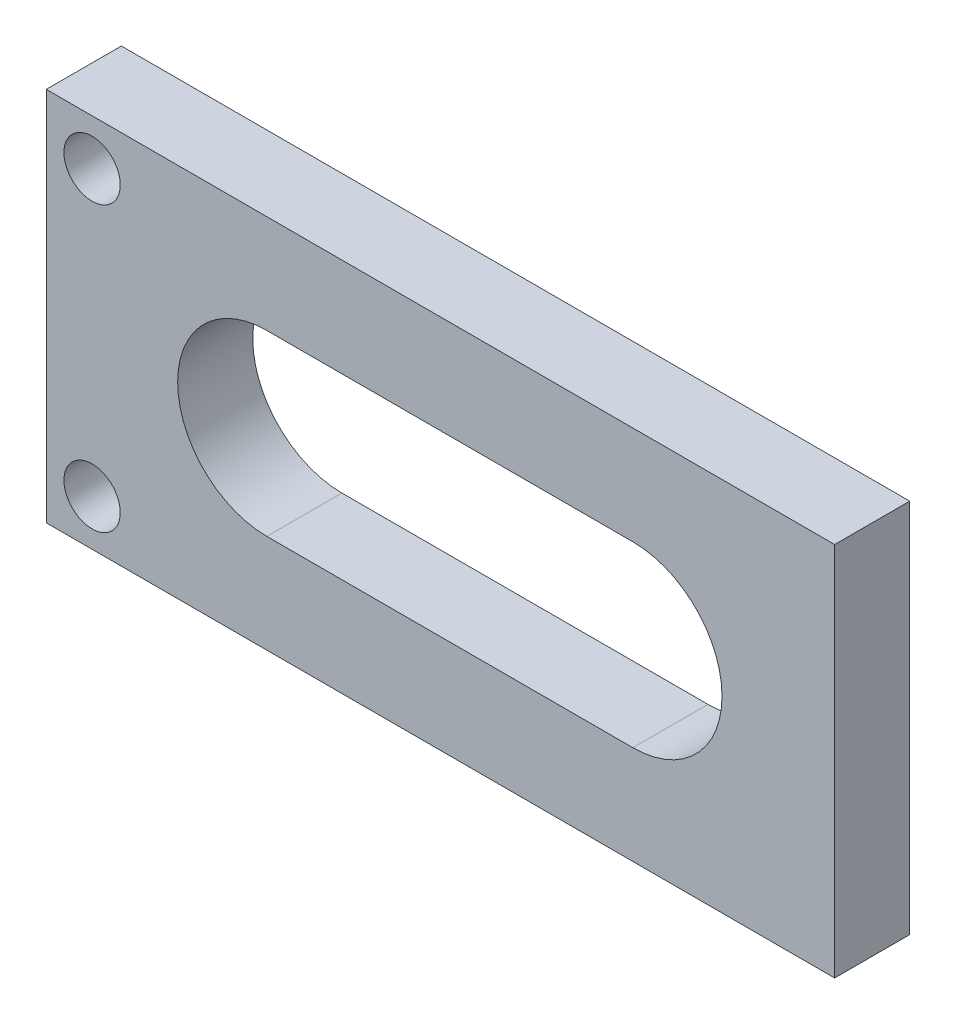
ISO-10303-21;
HEADER;
FILE_DESCRIPTION(('STEP AP214'),'2;1');
FILE_NAME('part.step','',(''),(''),'','','');
FILE_SCHEMA(('AUTOMOTIVE_DESIGN { 1 0 10303 214 1 1 1 1 }'));
ENDSEC;
DATA;
#1=APPLICATION_CONTEXT('core data for automotive mechanical design processes');
#2=APPLICATION_PROTOCOL_DEFINITION('international standard','automotive_design',2000,#1);
#3=PRODUCT_CONTEXT('',#1,'mechanical');
#4=PRODUCT('Part','Part','',(#3));
#5=PRODUCT_RELATED_PRODUCT_CATEGORY('part','',(#4));
#6=PRODUCT_DEFINITION_FORMATION('','',#4);
#7=PRODUCT_DEFINITION_CONTEXT('part definition',#1,'design');
#8=PRODUCT_DEFINITION('design','',#6,#7);
#9=PRODUCT_DEFINITION_SHAPE('','',#8);
#10=(LENGTH_UNIT() NAMED_UNIT(*) SI_UNIT(.MILLI.,.METRE.));
#11=(NAMED_UNIT(*) PLANE_ANGLE_UNIT() SI_UNIT($,.RADIAN.));
#12=(NAMED_UNIT(*) SI_UNIT($,.STERADIAN.) SOLID_ANGLE_UNIT());
#13=UNCERTAINTY_MEASURE_WITH_UNIT(LENGTH_MEASURE(1.E-05),#10,'distance_accuracy_value','');
#14=(GEOMETRIC_REPRESENTATION_CONTEXT(3) GLOBAL_UNCERTAINTY_ASSIGNED_CONTEXT((#13)) GLOBAL_UNIT_ASSIGNED_CONTEXT((#10,
#11,#12)) REPRESENTATION_CONTEXT('',''));
#15=CARTESIAN_POINT('',(0.,0.,0.));
#16=DIRECTION('',(0.,0.,1.));
#17=DIRECTION('',(1.,0.,0.));
#18=AXIS2_PLACEMENT_3D('',#15,#16,#17);
#19=CARTESIAN_POINT('',(0.,0.,4.));
#20=DIRECTION('',(0.,0.,1.));
#21=DIRECTION('',(1.,0.,0.));
#22=AXIS2_PLACEMENT_3D('',#19,#20,#21);
#23=PLANE('',#22);
#24=CARTESIAN_POINT('',(-18.5593059383903,-7.55930593839025,4.));
#25=DIRECTION('',(0.,0.,1.));
#26=DIRECTION('',(1.,0.,0.));
#27=AXIS2_PLACEMENT_3D('',#24,#25,#26);
#28=CIRCLE('',#27,1.5);
#29=CARTESIAN_POINT('',(-17.0593059383902,-7.55930593839025,4.));
#30=VERTEX_POINT('',#29);
#31=EDGE_CURVE('E135',#30,#30,#28,.T.);
#32=ORIENTED_EDGE('',*,*,#31,.F.);
#33=EDGE_LOOP('',(#32));
#34=FACE_BOUND('',#33,.T.);
#35=DIRECTION('',(0.,1.,0.));
#36=VECTOR('',#35,1.);
#37=CARTESIAN_POINT('',(21.,9.99999999999999,4.));
#38=LINE('',#37,#36);
#39=CARTESIAN_POINT('',(21.,-10.,4.));
#40=VERTEX_POINT('',#39);
#41=CARTESIAN_POINT('',(21.,9.99999999999999,4.));
#42=VERTEX_POINT('',#41);
#43=EDGE_CURVE('E145',#40,#42,#38,.T.);
#44=ORIENTED_EDGE('',*,*,#43,.T.);
#45=DIRECTION('',(-1.,0.,0.));
#46=VECTOR('',#45,1.);
#47=CARTESIAN_POINT('',(-21.,9.99999999999999,4.));
#48=LINE('',#47,#46);
#49=CARTESIAN_POINT('',(-21.,9.99999999999999,4.));
#50=VERTEX_POINT('',#49);
#51=EDGE_CURVE('E148',#42,#50,#48,.T.);
#52=ORIENTED_EDGE('',*,*,#51,.T.);
#53=DIRECTION('',(0.,-1.,0.));
#54=VECTOR('',#53,1.);
#55=CARTESIAN_POINT('',(-21.,9.99999999999999,4.));
#56=LINE('',#55,#54);
#57=CARTESIAN_POINT('',(-21.,-10.,4.));
#58=VERTEX_POINT('',#57);
#59=EDGE_CURVE('E151',#50,#58,#56,.T.);
#60=ORIENTED_EDGE('',*,*,#59,.T.);
#61=DIRECTION('',(1.,0.,0.));
#62=VECTOR('',#61,1.);
#63=CARTESIAN_POINT('',(-21.,-10.,4.));
#64=LINE('',#63,#62);
#65=EDGE_CURVE('E153',#58,#40,#64,.T.);
#66=ORIENTED_EDGE('',*,*,#65,.T.);
#67=EDGE_LOOP('',(#44,#52,#60,#66));
#68=FACE_BOUND('',#67,.T.);
#69=DIRECTION('',(1.,0.,0.));
#70=VECTOR('',#69,1.);
#71=CARTESIAN_POINT('',(-9.25000000000001,-4.75,4.));
#72=LINE('',#71,#70);
#73=CARTESIAN_POINT('',(-9.25000000000001,-4.75,4.));
#74=VERTEX_POINT('',#73);
#75=CARTESIAN_POINT('',(10.25,-4.75,4.));
#76=VERTEX_POINT('',#75);
#77=EDGE_CURVE('E114',#74,#76,#72,.T.);
#78=ORIENTED_EDGE('',*,*,#77,.F.);
#79=CARTESIAN_POINT('',(-9.25000000000001,0.,4.));
#80=DIRECTION('',(0.,0.,1.));
#81=DIRECTION('',(1.,0.,0.));
#82=AXIS2_PLACEMENT_3D('',#79,#80,#81);
#83=CIRCLE('',#82,4.75);
#84=CARTESIAN_POINT('',(-9.25000000000001,4.75,4.));
#85=VERTEX_POINT('',#84);
#86=EDGE_CURVE('E106',#85,#74,#83,.T.);
#87=ORIENTED_EDGE('',*,*,#86,.F.);
#88=DIRECTION('',(-1.,0.,0.));
#89=VECTOR('',#88,1.);
#90=CARTESIAN_POINT('',(-9.25000000000001,4.75,4.));
#91=LINE('',#90,#89);
#92=CARTESIAN_POINT('',(10.25,4.75,4.));
#93=VERTEX_POINT('',#92);
#94=EDGE_CURVE('E129',#93,#85,#91,.T.);
#95=ORIENTED_EDGE('',*,*,#94,.F.);
#96=CARTESIAN_POINT('',(10.25,0.,4.));
#97=DIRECTION('',(0.,0.,1.));
#98=DIRECTION('',(1.,0.,0.));
#99=AXIS2_PLACEMENT_3D('',#96,#97,#98);
#100=CIRCLE('',#99,4.75);
#101=EDGE_CURVE('E127',#76,#93,#100,.T.);
#102=ORIENTED_EDGE('',*,*,#101,.F.);
#103=EDGE_LOOP('',(#78,#87,#95,#102));
#104=FACE_BOUND('',#103,.T.);
#105=CARTESIAN_POINT('',(-18.5593059383903,7.55930593839025,4.));
#106=DIRECTION('',(0.,0.,1.));
#107=DIRECTION('',(-1.,0.,0.));
#108=AXIS2_PLACEMENT_3D('',#105,#106,#107);
#109=CIRCLE('',#108,1.5);
#110=CARTESIAN_POINT('',(-20.0593059383903,7.55930593839025,4.));
#111=VERTEX_POINT('',#110);
#112=EDGE_CURVE('E235',#111,#111,#109,.T.);
#113=ORIENTED_EDGE('',*,*,#112,.F.);
#114=EDGE_LOOP('',(#113));
#115=FACE_BOUND('',#114,.T.);
#116=ADVANCED_FACE('F41',(#34,#68,#104,#115),#23,.T.);
#117=CARTESIAN_POINT('',(0.,0.,0.));
#118=DIRECTION('',(0.,0.,1.));
#119=DIRECTION('',(1.,0.,0.));
#120=AXIS2_PLACEMENT_3D('',#117,#118,#119);
#121=PLANE('',#120);
#122=DIRECTION('',(0.,1.,0.));
#123=VECTOR('',#122,1.);
#124=CARTESIAN_POINT('',(21.,9.99999999999999,0.));
#125=LINE('',#124,#123);
#126=CARTESIAN_POINT('',(21.,-10.,0.));
#127=VERTEX_POINT('',#126);
#128=CARTESIAN_POINT('',(21.,9.99999999999999,0.));
#129=VERTEX_POINT('',#128);
#130=EDGE_CURVE('E122',#127,#129,#125,.T.);
#131=ORIENTED_EDGE('',*,*,#130,.F.);
#132=DIRECTION('',(1.,0.,0.));
#133=VECTOR('',#132,1.);
#134=CARTESIAN_POINT('',(-21.,-10.,0.));
#135=LINE('',#134,#133);
#136=CARTESIAN_POINT('',(-21.,-10.,0.));
#137=VERTEX_POINT('',#136);
#138=EDGE_CURVE('E149',#137,#127,#135,.T.);
#139=ORIENTED_EDGE('',*,*,#138,.F.);
#140=DIRECTION('',(0.,-1.,0.));
#141=VECTOR('',#140,1.);
#142=CARTESIAN_POINT('',(-21.,9.99999999999999,0.));
#143=LINE('',#142,#141);
#144=CARTESIAN_POINT('',(-21.,9.99999999999999,0.));
#145=VERTEX_POINT('',#144);
#146=EDGE_CURVE('E160',#145,#137,#143,.T.);
#147=ORIENTED_EDGE('',*,*,#146,.F.);
#148=DIRECTION('',(-1.,0.,0.));
#149=VECTOR('',#148,1.);
#150=CARTESIAN_POINT('',(-21.,9.99999999999999,0.));
#151=LINE('',#150,#149);
#152=EDGE_CURVE('E158',#129,#145,#151,.T.);
#153=ORIENTED_EDGE('',*,*,#152,.F.);
#154=EDGE_LOOP('',(#131,#139,#147,#153));
#155=FACE_BOUND('',#154,.T.);
#156=CARTESIAN_POINT('',(-9.25000000000001,0.,0.));
#157=DIRECTION('',(0.,0.,1.));
#158=DIRECTION('',(1.,0.,0.));
#159=AXIS2_PLACEMENT_3D('',#156,#157,#158);
#160=CIRCLE('',#159,4.75);
#161=CARTESIAN_POINT('',(-9.25000000000001,4.75,0.));
#162=VERTEX_POINT('',#161);
#163=CARTESIAN_POINT('',(-9.25000000000001,-4.75,0.));
#164=VERTEX_POINT('',#163);
#165=EDGE_CURVE('E64',#162,#164,#160,.T.);
#166=ORIENTED_EDGE('',*,*,#165,.T.);
#167=DIRECTION('',(1.,0.,0.));
#168=VECTOR('',#167,1.);
#169=CARTESIAN_POINT('',(-9.25000000000001,-4.75,0.));
#170=LINE('',#169,#168);
#171=CARTESIAN_POINT('',(10.25,-4.75,0.));
#172=VERTEX_POINT('',#171);
#173=EDGE_CURVE('E121',#164,#172,#170,.T.);
#174=ORIENTED_EDGE('',*,*,#173,.T.);
#175=CARTESIAN_POINT('',(10.25,0.,0.));
#176=DIRECTION('',(0.,0.,1.));
#177=DIRECTION('',(1.,0.,0.));
#178=AXIS2_PLACEMENT_3D('',#175,#176,#177);
#179=CIRCLE('',#178,4.75);
#180=CARTESIAN_POINT('',(10.25,4.75,0.));
#181=VERTEX_POINT('',#180);
#182=EDGE_CURVE('E137',#172,#181,#179,.T.);
#183=ORIENTED_EDGE('',*,*,#182,.T.);
#184=DIRECTION('',(-1.,0.,0.));
#185=VECTOR('',#184,1.);
#186=CARTESIAN_POINT('',(-9.25000000000001,4.75,0.));
#187=LINE('',#186,#185);
#188=EDGE_CURVE('E115',#181,#162,#187,.T.);
#189=ORIENTED_EDGE('',*,*,#188,.T.);
#190=EDGE_LOOP('',(#166,#174,#183,#189));
#191=FACE_BOUND('',#190,.T.);
#192=CARTESIAN_POINT('',(-18.5593059383903,-7.55930593839025,0.));
#193=DIRECTION('',(0.,0.,1.));
#194=DIRECTION('',(1.,0.,0.));
#195=AXIS2_PLACEMENT_3D('',#192,#193,#194);
#196=CIRCLE('',#195,1.5);
#197=CARTESIAN_POINT('',(-17.0593059383902,-7.55930593839025,0.));
#198=VERTEX_POINT('',#197);
#199=EDGE_CURVE('E241',#198,#198,#196,.T.);
#200=ORIENTED_EDGE('',*,*,#199,.T.);
#201=EDGE_LOOP('',(#200));
#202=FACE_BOUND('',#201,.T.);
#203=CARTESIAN_POINT('',(-18.5593059383903,7.55930593839025,0.));
#204=DIRECTION('',(0.,0.,1.));
#205=DIRECTION('',(-1.,0.,0.));
#206=AXIS2_PLACEMENT_3D('',#203,#204,#205);
#207=CIRCLE('',#206,1.5);
#208=CARTESIAN_POINT('',(-20.0593059383903,7.55930593839025,0.));
#209=VERTEX_POINT('',#208);
#210=EDGE_CURVE('E238',#209,#209,#207,.T.);
#211=ORIENTED_EDGE('',*,*,#210,.T.);
#212=EDGE_LOOP('',(#211));
#213=FACE_BOUND('',#212,.T.);
#214=ADVANCED_FACE('F178',(#155,#191,#202,#213),#121,.F.);
#215=CARTESIAN_POINT('',(21.,9.99999999999999,4.));
#216=DIRECTION('',(-1.,0.,0.));
#217=DIRECTION('',(0.,0.,1.));
#218=AXIS2_PLACEMENT_3D('',#215,#216,#217);
#219=PLANE('',#218);
#220=ORIENTED_EDGE('',*,*,#130,.T.);
#221=DIRECTION('',(0.,0.,-1.));
#222=VECTOR('',#221,1.);
#223=CARTESIAN_POINT('',(21.,9.99999999999999,4.));
#224=LINE('',#223,#222);
#225=EDGE_CURVE('E11',#42,#129,#224,.T.);
#226=ORIENTED_EDGE('',*,*,#225,.F.);
#227=ORIENTED_EDGE('',*,*,#43,.F.);
#228=DIRECTION('',(0.,0.,-1.));
#229=VECTOR('',#228,1.);
#230=CARTESIAN_POINT('',(21.,-10.,4.));
#231=LINE('',#230,#229);
#232=EDGE_CURVE('E155',#40,#127,#231,.T.);
#233=ORIENTED_EDGE('',*,*,#232,.T.);
#234=EDGE_LOOP('',(#220,#226,#227,#233));
#235=FACE_BOUND('',#234,.T.);
#236=ADVANCED_FACE('F43',(#235),#219,.F.);
#237=CARTESIAN_POINT('',(-21.,9.99999999999999,4.));
#238=DIRECTION('',(0.,-1.,0.));
#239=DIRECTION('',(0.,0.,-1.));
#240=AXIS2_PLACEMENT_3D('',#237,#238,#239);
#241=PLANE('',#240);
#242=ORIENTED_EDGE('',*,*,#152,.T.);
#243=DIRECTION('',(0.,0.,-1.));
#244=VECTOR('',#243,1.);
#245=CARTESIAN_POINT('',(-21.,9.99999999999999,4.));
#246=LINE('',#245,#244);
#247=EDGE_CURVE('E49',#50,#145,#246,.T.);
#248=ORIENTED_EDGE('',*,*,#247,.F.);
#249=ORIENTED_EDGE('',*,*,#51,.F.);
#250=ORIENTED_EDGE('',*,*,#225,.T.);
#251=EDGE_LOOP('',(#242,#248,#249,#250));
#252=FACE_BOUND('',#251,.T.);
#253=ADVANCED_FACE('F188',(#252),#241,.F.);
#254=CARTESIAN_POINT('',(-21.,9.99999999999999,4.));
#255=DIRECTION('',(1.,0.,0.));
#256=DIRECTION('',(0.,1.,0.));
#257=AXIS2_PLACEMENT_3D('',#254,#255,#256);
#258=PLANE('',#257);
#259=ORIENTED_EDGE('',*,*,#146,.T.);
#260=DIRECTION('',(0.,0.,-1.));
#261=VECTOR('',#260,1.);
#262=CARTESIAN_POINT('',(-21.,-10.,4.));
#263=LINE('',#262,#261);
#264=EDGE_CURVE('E165',#58,#137,#263,.T.);
#265=ORIENTED_EDGE('',*,*,#264,.F.);
#266=ORIENTED_EDGE('',*,*,#59,.F.);
#267=ORIENTED_EDGE('',*,*,#247,.T.);
#268=EDGE_LOOP('',(#259,#265,#266,#267));
#269=FACE_BOUND('',#268,.T.);
#270=ADVANCED_FACE('F172',(#269),#258,.F.);
#271=CARTESIAN_POINT('',(-21.,-10.,4.));
#272=DIRECTION('',(0.,1.,0.));
#273=DIRECTION('',(0.,0.,1.));
#274=AXIS2_PLACEMENT_3D('',#271,#272,#273);
#275=PLANE('',#274);
#276=ORIENTED_EDGE('',*,*,#138,.T.);
#277=ORIENTED_EDGE('',*,*,#232,.F.);
#278=ORIENTED_EDGE('',*,*,#65,.F.);
#279=ORIENTED_EDGE('',*,*,#264,.T.);
#280=EDGE_LOOP('',(#276,#277,#278,#279));
#281=FACE_BOUND('',#280,.T.);
#282=ADVANCED_FACE('F182',(#281),#275,.F.);
#283=CARTESIAN_POINT('',(-9.25000000000001,0.,4.));
#284=DIRECTION('',(0.,0.,-1.));
#285=DIRECTION('',(-1.,0.,0.));
#286=AXIS2_PLACEMENT_3D('',#283,#284,#285);
#287=CYLINDRICAL_SURFACE('',#286,4.75);
#288=ORIENTED_EDGE('',*,*,#165,.F.);
#289=DIRECTION('',(0.,0.,-1.));
#290=VECTOR('',#289,1.);
#291=CARTESIAN_POINT('',(-9.25000000000001,4.75,4.));
#292=LINE('',#291,#290);
#293=EDGE_CURVE('E110',#85,#162,#292,.T.);
#294=ORIENTED_EDGE('',*,*,#293,.F.);
#295=ORIENTED_EDGE('',*,*,#86,.T.);
#296=DIRECTION('',(0.,0.,-1.));
#297=VECTOR('',#296,1.);
#298=CARTESIAN_POINT('',(-9.25000000000001,-4.75,4.));
#299=LINE('',#298,#297);
#300=EDGE_CURVE('E109',#74,#164,#299,.T.);
#301=ORIENTED_EDGE('',*,*,#300,.T.);
#302=EDGE_LOOP('',(#288,#294,#295,#301));
#303=FACE_BOUND('',#302,.T.);
#304=ADVANCED_FACE('F108',(#303),#287,.F.);
#305=CARTESIAN_POINT('',(-9.25000000000001,-4.75,4.));
#306=DIRECTION('',(0.,1.,0.));
#307=DIRECTION('',(0.,0.,1.));
#308=AXIS2_PLACEMENT_3D('',#305,#306,#307);
#309=PLANE('',#308);
#310=ORIENTED_EDGE('',*,*,#173,.F.);
#311=ORIENTED_EDGE('',*,*,#300,.F.);
#312=ORIENTED_EDGE('',*,*,#77,.T.);
#313=DIRECTION('',(0.,0.,-1.));
#314=VECTOR('',#313,1.);
#315=CARTESIAN_POINT('',(10.25,-4.75,4.));
#316=LINE('',#315,#314);
#317=EDGE_CURVE('E123',#76,#172,#316,.T.);
#318=ORIENTED_EDGE('',*,*,#317,.T.);
#319=EDGE_LOOP('',(#310,#311,#312,#318));
#320=FACE_BOUND('',#319,.T.);
#321=ADVANCED_FACE('F118',(#320),#309,.T.);
#322=CARTESIAN_POINT('',(10.25,0.,4.));
#323=DIRECTION('',(0.,0.,-1.));
#324=DIRECTION('',(-1.,0.,0.));
#325=AXIS2_PLACEMENT_3D('',#322,#323,#324);
#326=CYLINDRICAL_SURFACE('',#325,4.75);
#327=ORIENTED_EDGE('',*,*,#182,.F.);
#328=ORIENTED_EDGE('',*,*,#317,.F.);
#329=ORIENTED_EDGE('',*,*,#101,.T.);
#330=DIRECTION('',(0.,0.,-1.));
#331=VECTOR('',#330,1.);
#332=CARTESIAN_POINT('',(10.25,4.75,4.));
#333=LINE('',#332,#331);
#334=EDGE_CURVE('E56',#93,#181,#333,.T.);
#335=ORIENTED_EDGE('',*,*,#334,.T.);
#336=EDGE_LOOP('',(#327,#328,#329,#335));
#337=FACE_BOUND('',#336,.T.);
#338=ADVANCED_FACE('F213',(#337),#326,.F.);
#339=CARTESIAN_POINT('',(-9.25000000000001,4.75,4.));
#340=DIRECTION('',(0.,-1.,0.));
#341=DIRECTION('',(0.,0.,-1.));
#342=AXIS2_PLACEMENT_3D('',#339,#340,#341);
#343=PLANE('',#342);
#344=ORIENTED_EDGE('',*,*,#188,.F.);
#345=ORIENTED_EDGE('',*,*,#334,.F.);
#346=ORIENTED_EDGE('',*,*,#94,.T.);
#347=ORIENTED_EDGE('',*,*,#293,.T.);
#348=EDGE_LOOP('',(#344,#345,#346,#347));
#349=FACE_BOUND('',#348,.T.);
#350=ADVANCED_FACE('F217',(#349),#343,.T.);
#351=CARTESIAN_POINT('',(-18.5593059383903,-7.55930593839025,4.));
#352=DIRECTION('',(0.,0.,-1.));
#353=DIRECTION('',(-1.,0.,0.));
#354=AXIS2_PLACEMENT_3D('',#351,#352,#353);
#355=CYLINDRICAL_SURFACE('',#354,1.5);
#356=ORIENTED_EDGE('',*,*,#31,.T.);
#357=EDGE_LOOP('',(#356));
#358=FACE_BOUND('',#357,.T.);
#359=ORIENTED_EDGE('',*,*,#199,.F.);
#360=EDGE_LOOP('',(#359));
#361=FACE_BOUND('',#360,.T.);
#362=ADVANCED_FACE('F223',(#358,#361),#355,.F.);
#363=CARTESIAN_POINT('',(-18.5593059383903,7.55930593839025,4.));
#364=DIRECTION('',(0.,0.,-1.));
#365=DIRECTION('',(-1.,0.,0.));
#366=AXIS2_PLACEMENT_3D('',#363,#364,#365);
#367=CYLINDRICAL_SURFACE('',#366,1.5);
#368=ORIENTED_EDGE('',*,*,#112,.T.);
#369=EDGE_LOOP('',(#368));
#370=FACE_BOUND('',#369,.T.);
#371=ORIENTED_EDGE('',*,*,#210,.F.);
#372=EDGE_LOOP('',(#371));
#373=FACE_BOUND('',#372,.T.);
#374=ADVANCED_FACE('F226',(#370,#373),#367,.F.);
#375=CLOSED_SHELL('',(#116,#214,#236,#253,#270,#282,#304,#321,#338,#350,#362,#374));
#376=MANIFOLD_SOLID_BREP('B2',#375);
#377=ADVANCED_BREP_SHAPE_REPRESENTATION('',(#18,#376),#14);
#378=SHAPE_DEFINITION_REPRESENTATION(#9,#377);
ENDSEC;
END-ISO-10303-21;
